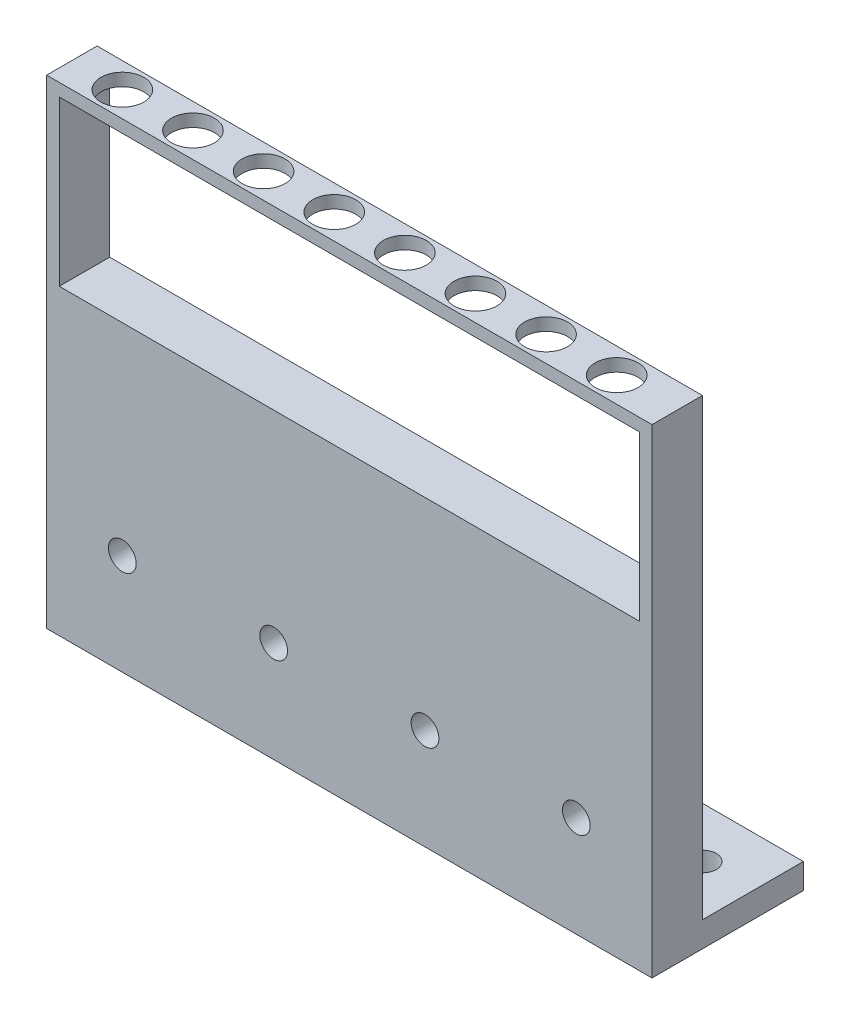
ISO-10303-21;
HEADER;
FILE_DESCRIPTION(('STEP AP214'),'2;1');
FILE_NAME('part.step','',(''),(''),'','','');
FILE_SCHEMA(('AUTOMOTIVE_DESIGN { 1 0 10303 214 1 1 1 1 }'));
ENDSEC;
DATA;
#1=APPLICATION_CONTEXT('core data for automotive mechanical design processes');
#2=APPLICATION_PROTOCOL_DEFINITION('international standard','automotive_design',2000,#1);
#3=PRODUCT_CONTEXT('',#1,'mechanical');
#4=PRODUCT('Part','Part','',(#3));
#5=PRODUCT_RELATED_PRODUCT_CATEGORY('part','',(#4));
#6=PRODUCT_DEFINITION_FORMATION('','',#4);
#7=PRODUCT_DEFINITION_CONTEXT('part definition',#1,'design');
#8=PRODUCT_DEFINITION('design','',#6,#7);
#9=PRODUCT_DEFINITION_SHAPE('','',#8);
#10=(LENGTH_UNIT() NAMED_UNIT(*) SI_UNIT(.MILLI.,.METRE.));
#11=(NAMED_UNIT(*) PLANE_ANGLE_UNIT() SI_UNIT($,.RADIAN.));
#12=(NAMED_UNIT(*) SI_UNIT($,.STERADIAN.) SOLID_ANGLE_UNIT());
#13=UNCERTAINTY_MEASURE_WITH_UNIT(LENGTH_MEASURE(1.E-05),#10,'distance_accuracy_value','');
#14=(GEOMETRIC_REPRESENTATION_CONTEXT(3) GLOBAL_UNCERTAINTY_ASSIGNED_CONTEXT((#13)) GLOBAL_UNIT_ASSIGNED_CONTEXT((#10,
#11,#12)) REPRESENTATION_CONTEXT('',''));
#15=CARTESIAN_POINT('',(0.,0.,0.));
#16=DIRECTION('',(0.,0.,1.));
#17=DIRECTION('',(1.,0.,0.));
#18=AXIS2_PLACEMENT_3D('',#15,#16,#17);
#19=CARTESIAN_POINT('',(-76.2,76.2,-6.35));
#20=DIRECTION('',(0.,0.,1.));
#21=DIRECTION('',(1.,0.,0.));
#22=AXIS2_PLACEMENT_3D('',#19,#20,#21);
#23=PLANE('',#22);
#24=CARTESIAN_POINT('',(19.05,25.4,-6.35));
#25=DIRECTION('',(0.,0.,-1.));
#26=DIRECTION('',(-1.,0.,0.));
#27=AXIS2_PLACEMENT_3D('',#24,#25,#26);
#28=CIRCLE('',#27,3.49250000000001);
#29=CARTESIAN_POINT('',(15.5575,25.4,-6.35));
#30=VERTEX_POINT('',#29);
#31=EDGE_CURVE('E321',#30,#30,#28,.T.);
#32=ORIENTED_EDGE('',*,*,#31,.F.);
#33=EDGE_LOOP('',(#32));
#34=FACE_BOUND('',#33,.T.);
#35=CARTESIAN_POINT('',(-19.05,25.4,-6.35));
#36=DIRECTION('',(0.,0.,-1.));
#37=DIRECTION('',(-1.,0.,0.));
#38=AXIS2_PLACEMENT_3D('',#35,#36,#37);
#39=CIRCLE('',#38,3.49250000000001);
#40=CARTESIAN_POINT('',(-22.5425,25.4,-6.35));
#41=VERTEX_POINT('',#40);
#42=EDGE_CURVE('E315',#41,#41,#39,.T.);
#43=ORIENTED_EDGE('',*,*,#42,.F.);
#44=EDGE_LOOP('',(#43));
#45=FACE_BOUND('',#44,.T.);
#46=CARTESIAN_POINT('',(-57.15,25.4,-6.35));
#47=DIRECTION('',(0.,0.,-1.));
#48=DIRECTION('',(-1.,0.,0.));
#49=AXIS2_PLACEMENT_3D('',#46,#47,#48);
#50=CIRCLE('',#49,3.49250000000001);
#51=CARTESIAN_POINT('',(-60.6425,25.4,-6.35));
#52=VERTEX_POINT('',#51);
#53=EDGE_CURVE('E309',#52,#52,#50,.T.);
#54=ORIENTED_EDGE('',*,*,#53,.F.);
#55=EDGE_LOOP('',(#54));
#56=FACE_BOUND('',#55,.T.);
#57=CARTESIAN_POINT('',(57.15,25.4,-6.35));
#58=DIRECTION('',(0.,0.,-1.));
#59=DIRECTION('',(-1.,0.,0.));
#60=AXIS2_PLACEMENT_3D('',#57,#58,#59);
#61=CIRCLE('',#60,3.49250000000001);
#62=CARTESIAN_POINT('',(53.6575,25.4,-6.35));
#63=VERTEX_POINT('',#62);
#64=EDGE_CURVE('E303',#63,#63,#61,.T.);
#65=ORIENTED_EDGE('',*,*,#64,.F.);
#66=EDGE_LOOP('',(#65));
#67=FACE_BOUND('',#66,.T.);
#68=DIRECTION('',(-1.,0.,0.));
#69=VECTOR('',#68,1.);
#70=CARTESIAN_POINT('',(-76.2,76.2,-6.35));
#71=LINE('',#70,#69);
#72=CARTESIAN_POINT('',(73.025,76.2,-6.34999999999999));
#73=VERTEX_POINT('',#72);
#74=CARTESIAN_POINT('',(-73.025,76.2,-6.35));
#75=VERTEX_POINT('',#74);
#76=EDGE_CURVE('E212',#73,#75,#71,.T.);
#77=ORIENTED_EDGE('',*,*,#76,.F.);
#78=DIRECTION('',(0.,1.,0.));
#79=VECTOR('',#78,1.);
#80=CARTESIAN_POINT('',(73.025,76.2,-6.34999999999999));
#81=LINE('',#80,#79);
#82=CARTESIAN_POINT('',(73.025,117.475,-6.34999999999999));
#83=VERTEX_POINT('',#82);
#84=EDGE_CURVE('E253',#73,#83,#81,.T.);
#85=ORIENTED_EDGE('',*,*,#84,.T.);
#86=DIRECTION('',(-1.,0.,0.));
#87=VECTOR('',#86,1.);
#88=CARTESIAN_POINT('',(73.025,117.475,-6.34999999999999));
#89=LINE('',#88,#87);
#90=CARTESIAN_POINT('',(-73.025,117.475,-6.34999999999999));
#91=VERTEX_POINT('',#90);
#92=EDGE_CURVE('E147',#83,#91,#89,.T.);
#93=ORIENTED_EDGE('',*,*,#92,.T.);
#94=DIRECTION('',(0.,-1.,0.));
#95=VECTOR('',#94,1.);
#96=CARTESIAN_POINT('',(-73.025,117.475,-6.34999999999999));
#97=LINE('',#96,#95);
#98=EDGE_CURVE('E115',#91,#75,#97,.T.);
#99=ORIENTED_EDGE('',*,*,#98,.T.);
#100=EDGE_LOOP('',(#77,#85,#93,#99));
#101=FACE_BOUND('',#100,.T.);
#102=DIRECTION('',(1.,0.,0.));
#103=VECTOR('',#102,1.);
#104=CARTESIAN_POINT('',(-76.2,6.35,-6.35));
#105=LINE('',#104,#103);
#106=CARTESIAN_POINT('',(-76.2,6.35000000000002,-6.35));
#107=VERTEX_POINT('',#106);
#108=CARTESIAN_POINT('',(76.2,6.35,-6.35));
#109=VERTEX_POINT('',#108);
#110=EDGE_CURVE('E196',#107,#109,#105,.T.);
#111=ORIENTED_EDGE('',*,*,#110,.F.);
#112=DIRECTION('',(0.,-1.,0.));
#113=VECTOR('',#112,1.);
#114=CARTESIAN_POINT('',(-76.2,76.2,-6.35));
#115=LINE('',#114,#113);
#116=CARTESIAN_POINT('',(-76.2,120.65,-6.34999999999999));
#117=VERTEX_POINT('',#116);
#118=EDGE_CURVE('E41',#117,#107,#115,.T.);
#119=ORIENTED_EDGE('',*,*,#118,.F.);
#120=DIRECTION('',(1.,0.,0.));
#121=VECTOR('',#120,1.);
#122=CARTESIAN_POINT('',(-76.2,120.65,-6.34999999999999));
#123=LINE('',#122,#121);
#124=CARTESIAN_POINT('',(76.2,120.65,-6.34999999999999));
#125=VERTEX_POINT('',#124);
#126=EDGE_CURVE('E137',#117,#125,#123,.T.);
#127=ORIENTED_EDGE('',*,*,#126,.T.);
#128=DIRECTION('',(0.,-1.,0.));
#129=VECTOR('',#128,1.);
#130=CARTESIAN_POINT('',(76.2,76.2,-6.35));
#131=LINE('',#130,#129);
#132=EDGE_CURVE('E11',#125,#109,#131,.T.);
#133=ORIENTED_EDGE('',*,*,#132,.T.);
#134=EDGE_LOOP('',(#111,#119,#127,#133));
#135=FACE_BOUND('',#134,.T.);
#136=ADVANCED_FACE('F33',(#34,#45,#56,#67,#101,#135),#23,.F.);
#137=CARTESIAN_POINT('',(76.2,76.2,6.35));
#138=DIRECTION('',(-1.,0.,0.));
#139=DIRECTION('',(0.,0.,1.));
#140=AXIS2_PLACEMENT_3D('',#137,#138,#139);
#141=PLANE('',#140);
#142=DIRECTION('',(0.,0.,-1.));
#143=VECTOR('',#142,1.);
#144=CARTESIAN_POINT('',(76.2,0.,6.35));
#145=LINE('',#144,#143);
#146=CARTESIAN_POINT('',(76.2,0.,6.35));
#147=VERTEX_POINT('',#146);
#148=CARTESIAN_POINT('',(76.2,0.,-31.75));
#149=VERTEX_POINT('',#148);
#150=EDGE_CURVE('E211',#147,#149,#145,.T.);
#151=ORIENTED_EDGE('',*,*,#150,.T.);
#152=DIRECTION('',(0.,-1.,0.));
#153=VECTOR('',#152,1.);
#154=CARTESIAN_POINT('',(76.2,6.35,-31.75));
#155=LINE('',#154,#153);
#156=CARTESIAN_POINT('',(76.2,6.35,-31.75));
#157=VERTEX_POINT('',#156);
#158=EDGE_CURVE('E208',#157,#149,#155,.T.);
#159=ORIENTED_EDGE('',*,*,#158,.F.);
#160=DIRECTION('',(0.,0.,-1.));
#161=VECTOR('',#160,1.);
#162=CARTESIAN_POINT('',(76.2,6.35,-6.35));
#163=LINE('',#162,#161);
#164=EDGE_CURVE('E199',#109,#157,#163,.T.);
#165=ORIENTED_EDGE('',*,*,#164,.F.);
#166=ORIENTED_EDGE('',*,*,#132,.F.);
#167=DIRECTION('',(0.,0.,1.));
#168=VECTOR('',#167,1.);
#169=CARTESIAN_POINT('',(76.2,120.65,-165.1));
#170=LINE('',#169,#168);
#171=CARTESIAN_POINT('',(76.2,120.65,6.35));
#172=VERTEX_POINT('',#171);
#173=EDGE_CURVE('E148',#125,#172,#170,.T.);
#174=ORIENTED_EDGE('',*,*,#173,.T.);
#175=DIRECTION('',(0.,-1.,0.));
#176=VECTOR('',#175,1.);
#177=CARTESIAN_POINT('',(76.2,76.2,6.35));
#178=LINE('',#177,#176);
#179=EDGE_CURVE('E216',#172,#147,#178,.T.);
#180=ORIENTED_EDGE('',*,*,#179,.T.);
#181=EDGE_LOOP('',(#151,#159,#165,#166,#174,#180));
#182=FACE_BOUND('',#181,.T.);
#183=ADVANCED_FACE('F35',(#182),#141,.F.);
#184=CARTESIAN_POINT('',(-76.2,76.2,6.35));
#185=DIRECTION('',(1.,0.,0.));
#186=DIRECTION('',(0.,0.,-1.));
#187=AXIS2_PLACEMENT_3D('',#184,#185,#186);
#188=PLANE('',#187);
#189=DIRECTION('',(0.,0.,1.));
#190=VECTOR('',#189,1.);
#191=CARTESIAN_POINT('',(-76.2,0.,6.35));
#192=LINE('',#191,#190);
#193=CARTESIAN_POINT('',(-76.2,0.,-31.75));
#194=VERTEX_POINT('',#193);
#195=CARTESIAN_POINT('',(-76.2,0.,6.35));
#196=VERTEX_POINT('',#195);
#197=EDGE_CURVE('E218',#194,#196,#192,.T.);
#198=ORIENTED_EDGE('',*,*,#197,.T.);
#199=DIRECTION('',(0.,-1.,0.));
#200=VECTOR('',#199,1.);
#201=CARTESIAN_POINT('',(-76.2,76.2,6.35));
#202=LINE('',#201,#200);
#203=CARTESIAN_POINT('',(-76.2,120.65,6.35));
#204=VERTEX_POINT('',#203);
#205=EDGE_CURVE('E223',#204,#196,#202,.T.);
#206=ORIENTED_EDGE('',*,*,#205,.F.);
#207=DIRECTION('',(0.,0.,1.));
#208=VECTOR('',#207,1.);
#209=CARTESIAN_POINT('',(-76.2,120.65,-165.1));
#210=LINE('',#209,#208);
#211=EDGE_CURVE('E144',#117,#204,#210,.T.);
#212=ORIENTED_EDGE('',*,*,#211,.F.);
#213=ORIENTED_EDGE('',*,*,#118,.T.);
#214=DIRECTION('',(0.,0.,1.));
#215=VECTOR('',#214,1.);
#216=CARTESIAN_POINT('',(-76.2,6.35,-19.05));
#217=LINE('',#216,#215);
#218=CARTESIAN_POINT('',(-76.2,6.35,-31.75));
#219=VERTEX_POINT('',#218);
#220=EDGE_CURVE('E193',#219,#107,#217,.T.);
#221=ORIENTED_EDGE('',*,*,#220,.F.);
#222=DIRECTION('',(0.,-1.,0.));
#223=VECTOR('',#222,1.);
#224=CARTESIAN_POINT('',(-76.2,6.35,-31.75));
#225=LINE('',#224,#223);
#226=EDGE_CURVE('E203',#219,#194,#225,.T.);
#227=ORIENTED_EDGE('',*,*,#226,.T.);
#228=EDGE_LOOP('',(#198,#206,#212,#213,#221,#227));
#229=FACE_BOUND('',#228,.T.);
#230=ADVANCED_FACE('F229',(#229),#188,.F.);
#231=CARTESIAN_POINT('',(-76.2,76.2,6.35));
#232=DIRECTION('',(0.,0.,-1.));
#233=DIRECTION('',(-1.,0.,0.));
#234=AXIS2_PLACEMENT_3D('',#231,#232,#233);
#235=PLANE('',#234);
#236=CARTESIAN_POINT('',(19.05,25.4,6.35));
#237=DIRECTION('',(0.,0.,-1.));
#238=DIRECTION('',(-1.,0.,0.));
#239=AXIS2_PLACEMENT_3D('',#236,#237,#238);
#240=CIRCLE('',#239,3.49250000000001);
#241=CARTESIAN_POINT('',(15.5575,25.4,6.35));
#242=VERTEX_POINT('',#241);
#243=EDGE_CURVE('E306',#242,#242,#240,.T.);
#244=ORIENTED_EDGE('',*,*,#243,.T.);
#245=EDGE_LOOP('',(#244));
#246=FACE_BOUND('',#245,.T.);
#247=CARTESIAN_POINT('',(-19.05,25.4,6.35));
#248=DIRECTION('',(0.,0.,-1.));
#249=DIRECTION('',(-1.,0.,0.));
#250=AXIS2_PLACEMENT_3D('',#247,#248,#249);
#251=CIRCLE('',#250,3.49250000000001);
#252=CARTESIAN_POINT('',(-22.5425,25.4,6.35));
#253=VERTEX_POINT('',#252);
#254=EDGE_CURVE('E318',#253,#253,#251,.T.);
#255=ORIENTED_EDGE('',*,*,#254,.T.);
#256=EDGE_LOOP('',(#255));
#257=FACE_BOUND('',#256,.T.);
#258=CARTESIAN_POINT('',(-57.15,25.4,6.35));
#259=DIRECTION('',(0.,0.,-1.));
#260=DIRECTION('',(-1.,0.,0.));
#261=AXIS2_PLACEMENT_3D('',#258,#259,#260);
#262=CIRCLE('',#261,3.49250000000001);
#263=CARTESIAN_POINT('',(-60.6425,25.4,6.35));
#264=VERTEX_POINT('',#263);
#265=EDGE_CURVE('E312',#264,#264,#262,.T.);
#266=ORIENTED_EDGE('',*,*,#265,.T.);
#267=EDGE_LOOP('',(#266));
#268=FACE_BOUND('',#267,.T.);
#269=CARTESIAN_POINT('',(57.15,25.4,6.35));
#270=DIRECTION('',(0.,0.,-1.));
#271=DIRECTION('',(-1.,0.,0.));
#272=AXIS2_PLACEMENT_3D('',#269,#270,#271);
#273=CIRCLE('',#272,3.49250000000001);
#274=CARTESIAN_POINT('',(53.6575,25.4,6.35));
#275=VERTEX_POINT('',#274);
#276=EDGE_CURVE('E265',#275,#275,#273,.T.);
#277=ORIENTED_EDGE('',*,*,#276,.T.);
#278=EDGE_LOOP('',(#277));
#279=FACE_BOUND('',#278,.T.);
#280=DIRECTION('',(1.,0.,0.));
#281=VECTOR('',#280,1.);
#282=CARTESIAN_POINT('',(-76.2,76.2,6.35));
#283=LINE('',#282,#281);
#284=CARTESIAN_POINT('',(-73.025,76.2,6.35));
#285=VERTEX_POINT('',#284);
#286=CARTESIAN_POINT('',(73.025,76.2,6.35));
#287=VERTEX_POINT('',#286);
#288=EDGE_CURVE('E48',#285,#287,#283,.T.);
#289=ORIENTED_EDGE('',*,*,#288,.F.);
#290=DIRECTION('',(0.,1.,0.));
#291=VECTOR('',#290,1.);
#292=CARTESIAN_POINT('',(-73.025,117.475,6.35));
#293=LINE('',#292,#291);
#294=CARTESIAN_POINT('',(-73.025,117.475,6.35));
#295=VERTEX_POINT('',#294);
#296=EDGE_CURVE('E113',#285,#295,#293,.T.);
#297=ORIENTED_EDGE('',*,*,#296,.T.);
#298=DIRECTION('',(1.,0.,0.));
#299=VECTOR('',#298,1.);
#300=CARTESIAN_POINT('',(73.025,117.475,6.35));
#301=LINE('',#300,#299);
#302=CARTESIAN_POINT('',(73.025,117.475,6.35));
#303=VERTEX_POINT('',#302);
#304=EDGE_CURVE('E121',#295,#303,#301,.T.);
#305=ORIENTED_EDGE('',*,*,#304,.T.);
#306=DIRECTION('',(0.,-1.,0.));
#307=VECTOR('',#306,1.);
#308=CARTESIAN_POINT('',(73.025,76.2,6.35));
#309=LINE('',#308,#307);
#310=EDGE_CURVE('E127',#303,#287,#309,.T.);
#311=ORIENTED_EDGE('',*,*,#310,.T.);
#312=EDGE_LOOP('',(#289,#297,#305,#311));
#313=FACE_BOUND('',#312,.T.);
#314=DIRECTION('',(1.,0.,0.));
#315=VECTOR('',#314,1.);
#316=CARTESIAN_POINT('',(-76.2,0.,6.35));
#317=LINE('',#316,#315);
#318=EDGE_CURVE('E214',#196,#147,#317,.T.);
#319=ORIENTED_EDGE('',*,*,#318,.T.);
#320=ORIENTED_EDGE('',*,*,#179,.F.);
#321=DIRECTION('',(-1.,0.,0.));
#322=VECTOR('',#321,1.);
#323=CARTESIAN_POINT('',(-76.2,120.65,6.35));
#324=LINE('',#323,#322);
#325=EDGE_CURVE('E141',#172,#204,#324,.T.);
#326=ORIENTED_EDGE('',*,*,#325,.T.);
#327=ORIENTED_EDGE('',*,*,#205,.T.);
#328=EDGE_LOOP('',(#319,#320,#326,#327));
#329=FACE_BOUND('',#328,.T.);
#330=ADVANCED_FACE('F129',(#246,#257,#268,#279,#313,#329),#235,.F.);
#331=CARTESIAN_POINT('',(0.,76.2,0.));
#332=DIRECTION('',(0.,-1.,0.));
#333=DIRECTION('',(0.,0.,-1.));
#334=AXIS2_PLACEMENT_3D('',#331,#332,#333);
#335=PLANE('',#334);
#336=ORIENTED_EDGE('',*,*,#288,.T.);
#337=DIRECTION('',(0.,0.,1.));
#338=VECTOR('',#337,1.);
#339=CARTESIAN_POINT('',(73.025,76.2,-165.1));
#340=LINE('',#339,#338);
#341=EDGE_CURVE('E151',#73,#287,#340,.T.);
#342=ORIENTED_EDGE('',*,*,#341,.F.);
#343=ORIENTED_EDGE('',*,*,#76,.T.);
#344=DIRECTION('',(0.,0.,1.));
#345=VECTOR('',#344,1.);
#346=CARTESIAN_POINT('',(-73.025,76.2,-165.1));
#347=LINE('',#346,#345);
#348=EDGE_CURVE('E53',#75,#285,#347,.T.);
#349=ORIENTED_EDGE('',*,*,#348,.T.);
#350=EDGE_LOOP('',(#336,#342,#343,#349));
#351=FACE_BOUND('',#350,.T.);
#352=ADVANCED_FACE('F343',(#351),#335,.F.);
#353=CARTESIAN_POINT('',(0.,0.,0.));
#354=DIRECTION('',(0.,-1.,0.));
#355=DIRECTION('',(0.,0.,-1.));
#356=AXIS2_PLACEMENT_3D('',#353,#354,#355);
#357=PLANE('',#356);
#358=ORIENTED_EDGE('',*,*,#150,.F.);
#359=ORIENTED_EDGE('',*,*,#318,.F.);
#360=ORIENTED_EDGE('',*,*,#197,.F.);
#361=DIRECTION('',(-1.,0.,0.));
#362=VECTOR('',#361,1.);
#363=CARTESIAN_POINT('',(76.2,0.,-31.75));
#364=LINE('',#363,#362);
#365=EDGE_CURVE('E190',#149,#194,#364,.T.);
#366=ORIENTED_EDGE('',*,*,#365,.F.);
#367=EDGE_LOOP('',(#358,#359,#360,#366));
#368=FACE_BOUND('',#367,.T.);
#369=CARTESIAN_POINT('',(-63.5,0.,-19.05));
#370=DIRECTION('',(0.,1.,0.));
#371=DIRECTION('',(0.,0.,1.));
#372=AXIS2_PLACEMENT_3D('',#369,#370,#371);
#373=CIRCLE('',#372,3.4925);
#374=CARTESIAN_POINT('',(-63.5,0.,-15.5575));
#375=VERTEX_POINT('',#374);
#376=EDGE_CURVE('E184',#375,#375,#373,.T.);
#377=ORIENTED_EDGE('',*,*,#376,.T.);
#378=EDGE_LOOP('',(#377));
#379=FACE_BOUND('',#378,.T.);
#380=CARTESIAN_POINT('',(-38.1,0.,-19.05));
#381=DIRECTION('',(0.,1.,0.));
#382=DIRECTION('',(0.,0.,1.));
#383=AXIS2_PLACEMENT_3D('',#380,#381,#382);
#384=CIRCLE('',#383,3.49250000000001);
#385=CARTESIAN_POINT('',(-38.1,0.,-15.5575));
#386=VERTEX_POINT('',#385);
#387=EDGE_CURVE('E178',#386,#386,#384,.T.);
#388=ORIENTED_EDGE('',*,*,#387,.T.);
#389=EDGE_LOOP('',(#388));
#390=FACE_BOUND('',#389,.T.);
#391=CARTESIAN_POINT('',(-12.7,0.,-19.05));
#392=DIRECTION('',(0.,1.,0.));
#393=DIRECTION('',(0.,0.,1.));
#394=AXIS2_PLACEMENT_3D('',#391,#392,#393);
#395=CIRCLE('',#394,3.4925);
#396=CARTESIAN_POINT('',(-12.7,0.,-15.5575));
#397=VERTEX_POINT('',#396);
#398=EDGE_CURVE('E172',#397,#397,#395,.T.);
#399=ORIENTED_EDGE('',*,*,#398,.T.);
#400=EDGE_LOOP('',(#399));
#401=FACE_BOUND('',#400,.T.);
#402=CARTESIAN_POINT('',(12.6999999999999,0.,-19.05));
#403=DIRECTION('',(0.,1.,0.));
#404=DIRECTION('',(0.,0.,1.));
#405=AXIS2_PLACEMENT_3D('',#402,#403,#404);
#406=CIRCLE('',#405,3.4925);
#407=CARTESIAN_POINT('',(12.6999999999999,0.,-15.5575));
#408=VERTEX_POINT('',#407);
#409=EDGE_CURVE('E166',#408,#408,#406,.T.);
#410=ORIENTED_EDGE('',*,*,#409,.T.);
#411=EDGE_LOOP('',(#410));
#412=FACE_BOUND('',#411,.T.);
#413=CARTESIAN_POINT('',(38.0999999999999,0.,-19.05));
#414=DIRECTION('',(0.,1.,0.));
#415=DIRECTION('',(0.,0.,1.));
#416=AXIS2_PLACEMENT_3D('',#413,#414,#415);
#417=CIRCLE('',#416,3.49250000000001);
#418=CARTESIAN_POINT('',(38.0999999999999,0.,-15.5575));
#419=VERTEX_POINT('',#418);
#420=EDGE_CURVE('E160',#419,#419,#417,.T.);
#421=ORIENTED_EDGE('',*,*,#420,.T.);
#422=EDGE_LOOP('',(#421));
#423=FACE_BOUND('',#422,.T.);
#424=CARTESIAN_POINT('',(63.4999999999999,0.,-19.05));
#425=DIRECTION('',(0.,1.,0.));
#426=DIRECTION('',(0.,0.,1.));
#427=AXIS2_PLACEMENT_3D('',#424,#425,#426);
#428=CIRCLE('',#427,3.49250000000001);
#429=CARTESIAN_POINT('',(63.4999999999999,0.,-15.5575));
#430=VERTEX_POINT('',#429);
#431=EDGE_CURVE('E156',#430,#430,#428,.T.);
#432=ORIENTED_EDGE('',*,*,#431,.T.);
#433=EDGE_LOOP('',(#432));
#434=FACE_BOUND('',#433,.T.);
#435=ADVANCED_FACE('F247',(#368,#379,#390,#401,#412,#423,#434),#357,.T.);
#436=CARTESIAN_POINT('',(0.,6.35,0.));
#437=DIRECTION('',(0.,1.,0.));
#438=DIRECTION('',(0.,0.,1.));
#439=AXIS2_PLACEMENT_3D('',#436,#437,#438);
#440=PLANE('',#439);
#441=CARTESIAN_POINT('',(38.0999999999999,6.35,-19.05));
#442=DIRECTION('',(0.,1.,0.));
#443=DIRECTION('',(0.,0.,1.));
#444=AXIS2_PLACEMENT_3D('',#441,#442,#443);
#445=CIRCLE('',#444,3.49250000000001);
#446=CARTESIAN_POINT('',(38.0999999999999,6.35,-15.5575));
#447=VERTEX_POINT('',#446);
#448=EDGE_CURVE('E163',#447,#447,#445,.T.);
#449=ORIENTED_EDGE('',*,*,#448,.F.);
#450=EDGE_LOOP('',(#449));
#451=FACE_BOUND('',#450,.T.);
#452=CARTESIAN_POINT('',(-12.7,6.35,-19.05));
#453=DIRECTION('',(0.,1.,0.));
#454=DIRECTION('',(0.,0.,1.));
#455=AXIS2_PLACEMENT_3D('',#452,#453,#454);
#456=CIRCLE('',#455,3.4925);
#457=CARTESIAN_POINT('',(-12.7,6.35,-15.5575));
#458=VERTEX_POINT('',#457);
#459=EDGE_CURVE('E175',#458,#458,#456,.T.);
#460=ORIENTED_EDGE('',*,*,#459,.F.);
#461=EDGE_LOOP('',(#460));
#462=FACE_BOUND('',#461,.T.);
#463=CARTESIAN_POINT('',(-63.5,6.35,-19.05));
#464=DIRECTION('',(0.,1.,0.));
#465=DIRECTION('',(0.,0.,1.));
#466=AXIS2_PLACEMENT_3D('',#463,#464,#465);
#467=CIRCLE('',#466,3.4925);
#468=CARTESIAN_POINT('',(-63.5,6.35,-15.5575));
#469=VERTEX_POINT('',#468);
#470=EDGE_CURVE('E187',#469,#469,#467,.T.);
#471=ORIENTED_EDGE('',*,*,#470,.F.);
#472=EDGE_LOOP('',(#471));
#473=FACE_BOUND('',#472,.T.);
#474=ORIENTED_EDGE('',*,*,#220,.T.);
#475=ORIENTED_EDGE('',*,*,#110,.T.);
#476=ORIENTED_EDGE('',*,*,#164,.T.);
#477=DIRECTION('',(-1.,0.,0.));
#478=VECTOR('',#477,1.);
#479=CARTESIAN_POINT('',(76.2,6.35,-31.75));
#480=LINE('',#479,#478);
#481=EDGE_CURVE('E201',#157,#219,#480,.T.);
#482=ORIENTED_EDGE('',*,*,#481,.T.);
#483=EDGE_LOOP('',(#474,#475,#476,#482));
#484=FACE_BOUND('',#483,.T.);
#485=CARTESIAN_POINT('',(-38.1,6.35,-19.05));
#486=DIRECTION('',(0.,1.,0.));
#487=DIRECTION('',(0.,0.,1.));
#488=AXIS2_PLACEMENT_3D('',#485,#486,#487);
#489=CIRCLE('',#488,3.49250000000001);
#490=CARTESIAN_POINT('',(-38.1,6.35,-15.5575));
#491=VERTEX_POINT('',#490);
#492=EDGE_CURVE('E181',#491,#491,#489,.T.);
#493=ORIENTED_EDGE('',*,*,#492,.F.);
#494=EDGE_LOOP('',(#493));
#495=FACE_BOUND('',#494,.T.);
#496=CARTESIAN_POINT('',(12.6999999999999,6.35,-19.05));
#497=DIRECTION('',(0.,1.,0.));
#498=DIRECTION('',(0.,0.,1.));
#499=AXIS2_PLACEMENT_3D('',#496,#497,#498);
#500=CIRCLE('',#499,3.4925);
#501=CARTESIAN_POINT('',(12.6999999999999,6.35,-15.5575));
#502=VERTEX_POINT('',#501);
#503=EDGE_CURVE('E169',#502,#502,#500,.T.);
#504=ORIENTED_EDGE('',*,*,#503,.F.);
#505=EDGE_LOOP('',(#504));
#506=FACE_BOUND('',#505,.T.);
#507=CARTESIAN_POINT('',(63.4999999999999,6.35,-19.05));
#508=DIRECTION('',(0.,1.,0.));
#509=DIRECTION('',(0.,0.,1.));
#510=AXIS2_PLACEMENT_3D('',#507,#508,#509);
#511=CIRCLE('',#510,3.49250000000001);
#512=CARTESIAN_POINT('',(63.4999999999999,6.35,-15.5575));
#513=VERTEX_POINT('',#512);
#514=EDGE_CURVE('E157',#513,#513,#511,.T.);
#515=ORIENTED_EDGE('',*,*,#514,.F.);
#516=EDGE_LOOP('',(#515));
#517=FACE_BOUND('',#516,.T.);
#518=ADVANCED_FACE('F234',(#451,#462,#473,#484,#495,#506,#517),#440,.T.);
#519=CARTESIAN_POINT('',(76.2,6.35,-31.75));
#520=DIRECTION('',(0.,0.,1.));
#521=DIRECTION('',(1.,0.,0.));
#522=AXIS2_PLACEMENT_3D('',#519,#520,#521);
#523=PLANE('',#522);
#524=ORIENTED_EDGE('',*,*,#365,.T.);
#525=ORIENTED_EDGE('',*,*,#226,.F.);
#526=ORIENTED_EDGE('',*,*,#481,.F.);
#527=ORIENTED_EDGE('',*,*,#158,.T.);
#528=EDGE_LOOP('',(#524,#525,#526,#527));
#529=FACE_BOUND('',#528,.T.);
#530=ADVANCED_FACE('F241',(#529),#523,.F.);
#531=CARTESIAN_POINT('',(-63.5,6.35,-19.05));
#532=DIRECTION('',(0.,-1.,0.));
#533=DIRECTION('',(0.,0.,-1.));
#534=AXIS2_PLACEMENT_3D('',#531,#532,#533);
#535=CYLINDRICAL_SURFACE('',#534,3.4925);
#536=ORIENTED_EDGE('',*,*,#470,.T.);
#537=EDGE_LOOP('',(#536));
#538=FACE_BOUND('',#537,.T.);
#539=ORIENTED_EDGE('',*,*,#376,.F.);
#540=EDGE_LOOP('',(#539));
#541=FACE_BOUND('',#540,.T.);
#542=ADVANCED_FACE('F380',(#538,#541),#535,.F.);
#543=CARTESIAN_POINT('',(-38.1,6.35,-19.05));
#544=DIRECTION('',(0.,-1.,0.));
#545=DIRECTION('',(0.,0.,-1.));
#546=AXIS2_PLACEMENT_3D('',#543,#544,#545);
#547=CYLINDRICAL_SURFACE('',#546,3.49250000000001);
#548=ORIENTED_EDGE('',*,*,#492,.T.);
#549=EDGE_LOOP('',(#548));
#550=FACE_BOUND('',#549,.T.);
#551=ORIENTED_EDGE('',*,*,#387,.F.);
#552=EDGE_LOOP('',(#551));
#553=FACE_BOUND('',#552,.T.);
#554=ADVANCED_FACE('F376',(#550,#553),#547,.F.);
#555=CARTESIAN_POINT('',(-12.7,6.35,-19.05));
#556=DIRECTION('',(0.,-1.,0.));
#557=DIRECTION('',(0.,0.,-1.));
#558=AXIS2_PLACEMENT_3D('',#555,#556,#557);
#559=CYLINDRICAL_SURFACE('',#558,3.4925);
#560=ORIENTED_EDGE('',*,*,#459,.T.);
#561=EDGE_LOOP('',(#560));
#562=FACE_BOUND('',#561,.T.);
#563=ORIENTED_EDGE('',*,*,#398,.F.);
#564=EDGE_LOOP('',(#563));
#565=FACE_BOUND('',#564,.T.);
#566=ADVANCED_FACE('F372',(#562,#565),#559,.F.);
#567=CARTESIAN_POINT('',(12.6999999999999,6.35,-19.05));
#568=DIRECTION('',(0.,-1.,0.));
#569=DIRECTION('',(0.,0.,-1.));
#570=AXIS2_PLACEMENT_3D('',#567,#568,#569);
#571=CYLINDRICAL_SURFACE('',#570,3.4925);
#572=ORIENTED_EDGE('',*,*,#503,.T.);
#573=EDGE_LOOP('',(#572));
#574=FACE_BOUND('',#573,.T.);
#575=ORIENTED_EDGE('',*,*,#409,.F.);
#576=EDGE_LOOP('',(#575));
#577=FACE_BOUND('',#576,.T.);
#578=ADVANCED_FACE('F368',(#574,#577),#571,.F.);
#579=CARTESIAN_POINT('',(38.0999999999999,6.35,-19.05));
#580=DIRECTION('',(0.,-1.,0.));
#581=DIRECTION('',(0.,0.,-1.));
#582=AXIS2_PLACEMENT_3D('',#579,#580,#581);
#583=CYLINDRICAL_SURFACE('',#582,3.49250000000001);
#584=ORIENTED_EDGE('',*,*,#448,.T.);
#585=EDGE_LOOP('',(#584));
#586=FACE_BOUND('',#585,.T.);
#587=ORIENTED_EDGE('',*,*,#420,.F.);
#588=EDGE_LOOP('',(#587));
#589=FACE_BOUND('',#588,.T.);
#590=ADVANCED_FACE('F364',(#586,#589),#583,.F.);
#591=CARTESIAN_POINT('',(63.4999999999999,6.35,-19.05));
#592=DIRECTION('',(0.,-1.,0.));
#593=DIRECTION('',(0.,0.,-1.));
#594=AXIS2_PLACEMENT_3D('',#591,#592,#593);
#595=CYLINDRICAL_SURFACE('',#594,3.49250000000001);
#596=ORIENTED_EDGE('',*,*,#514,.T.);
#597=EDGE_LOOP('',(#596));
#598=FACE_BOUND('',#597,.T.);
#599=ORIENTED_EDGE('',*,*,#431,.F.);
#600=EDGE_LOOP('',(#599));
#601=FACE_BOUND('',#600,.T.);
#602=ADVANCED_FACE('F354',(#598,#601),#595,.F.);
#603=CARTESIAN_POINT('',(-76.2,120.65,-165.1));
#604=DIRECTION('',(0.,1.,0.));
#605=DIRECTION('',(0.,0.,1.));
#606=AXIS2_PLACEMENT_3D('',#603,#604,#605);
#607=PLANE('',#606);
#608=CARTESIAN_POINT('',(-45.72,120.65,0.));
#609=DIRECTION('',(0.,1.,0.));
#610=DIRECTION('',(0.,0.,1.));
#611=AXIS2_PLACEMENT_3D('',#608,#609,#610);
#612=CIRCLE('',#611,5.3975);
#613=CARTESIAN_POINT('',(-45.72,120.65,5.3975));
#614=VERTEX_POINT('',#613);
#615=EDGE_CURVE('E259',#614,#614,#612,.T.);
#616=ORIENTED_EDGE('',*,*,#615,.F.);
#617=EDGE_LOOP('',(#616));
#618=FACE_BOUND('',#617,.T.);
#619=CARTESIAN_POINT('',(-27.94,120.65,0.));
#620=DIRECTION('',(0.,1.,0.));
#621=DIRECTION('',(0.,0.,1.));
#622=AXIS2_PLACEMENT_3D('',#619,#620,#621);
#623=CIRCLE('',#622,5.3975);
#624=CARTESIAN_POINT('',(-27.94,120.65,5.3975));
#625=VERTEX_POINT('',#624);
#626=EDGE_CURVE('E295',#625,#625,#623,.T.);
#627=ORIENTED_EDGE('',*,*,#626,.F.);
#628=EDGE_LOOP('',(#627));
#629=FACE_BOUND('',#628,.T.);
#630=CARTESIAN_POINT('',(-10.16,120.65,0.));
#631=DIRECTION('',(0.,1.,0.));
#632=DIRECTION('',(0.,0.,1.));
#633=AXIS2_PLACEMENT_3D('',#630,#631,#632);
#634=CIRCLE('',#633,5.3975);
#635=CARTESIAN_POINT('',(-10.16,120.65,5.3975));
#636=VERTEX_POINT('',#635);
#637=EDGE_CURVE('E289',#636,#636,#634,.T.);
#638=ORIENTED_EDGE('',*,*,#637,.F.);
#639=EDGE_LOOP('',(#638));
#640=FACE_BOUND('',#639,.T.);
#641=CARTESIAN_POINT('',(7.61999999999997,120.65,0.));
#642=DIRECTION('',(0.,1.,0.));
#643=DIRECTION('',(0.,0.,1.));
#644=AXIS2_PLACEMENT_3D('',#641,#642,#643);
#645=CIRCLE('',#644,5.3975);
#646=CARTESIAN_POINT('',(7.61999999999997,120.65,5.3975));
#647=VERTEX_POINT('',#646);
#648=EDGE_CURVE('E283',#647,#647,#645,.T.);
#649=ORIENTED_EDGE('',*,*,#648,.F.);
#650=EDGE_LOOP('',(#649));
#651=FACE_BOUND('',#650,.T.);
#652=CARTESIAN_POINT('',(25.4,120.65,0.));
#653=DIRECTION('',(0.,1.,0.));
#654=DIRECTION('',(0.,0.,1.));
#655=AXIS2_PLACEMENT_3D('',#652,#653,#654);
#656=CIRCLE('',#655,5.3975);
#657=CARTESIAN_POINT('',(25.4,120.65,5.3975));
#658=VERTEX_POINT('',#657);
#659=EDGE_CURVE('E277',#658,#658,#656,.T.);
#660=ORIENTED_EDGE('',*,*,#659,.F.);
#661=EDGE_LOOP('',(#660));
#662=FACE_BOUND('',#661,.T.);
#663=CARTESIAN_POINT('',(43.18,120.65,0.));
#664=DIRECTION('',(0.,1.,0.));
#665=DIRECTION('',(0.,0.,1.));
#666=AXIS2_PLACEMENT_3D('',#663,#664,#665);
#667=CIRCLE('',#666,5.3975);
#668=CARTESIAN_POINT('',(43.18,120.65,5.3975));
#669=VERTEX_POINT('',#668);
#670=EDGE_CURVE('E271',#669,#669,#667,.T.);
#671=ORIENTED_EDGE('',*,*,#670,.F.);
#672=EDGE_LOOP('',(#671));
#673=FACE_BOUND('',#672,.T.);
#674=CARTESIAN_POINT('',(60.96,120.65,0.));
#675=DIRECTION('',(0.,1.,0.));
#676=DIRECTION('',(0.,0.,1.));
#677=AXIS2_PLACEMENT_3D('',#674,#675,#676);
#678=CIRCLE('',#677,5.3975);
#679=CARTESIAN_POINT('',(60.96,120.65,5.3975));
#680=VERTEX_POINT('',#679);
#681=EDGE_CURVE('E264',#680,#680,#678,.T.);
#682=ORIENTED_EDGE('',*,*,#681,.F.);
#683=EDGE_LOOP('',(#682));
#684=FACE_BOUND('',#683,.T.);
#685=CARTESIAN_POINT('',(-63.5,120.65,0.));
#686=DIRECTION('',(0.,1.,0.));
#687=DIRECTION('',(0.,0.,1.));
#688=AXIS2_PLACEMENT_3D('',#685,#686,#687);
#689=CIRCLE('',#688,5.3975);
#690=CARTESIAN_POINT('',(-63.5,120.65,5.3975));
#691=VERTEX_POINT('',#690);
#692=EDGE_CURVE('E131',#691,#691,#689,.T.);
#693=ORIENTED_EDGE('',*,*,#692,.F.);
#694=EDGE_LOOP('',(#693));
#695=FACE_BOUND('',#694,.T.);
#696=ORIENTED_EDGE('',*,*,#126,.F.);
#697=ORIENTED_EDGE('',*,*,#211,.T.);
#698=ORIENTED_EDGE('',*,*,#325,.F.);
#699=ORIENTED_EDGE('',*,*,#173,.F.);
#700=EDGE_LOOP('',(#696,#697,#698,#699));
#701=FACE_BOUND('',#700,.T.);
#702=ADVANCED_FACE('F252',(#618,#629,#640,#651,#662,#673,#684,#695,#701),#607,.T.);
#703=CARTESIAN_POINT('',(73.025,76.2,-165.1));
#704=DIRECTION('',(-1.,0.,0.));
#705=DIRECTION('',(0.,0.,1.));
#706=AXIS2_PLACEMENT_3D('',#703,#704,#705);
#707=PLANE('',#706);
#708=ORIENTED_EDGE('',*,*,#84,.F.);
#709=ORIENTED_EDGE('',*,*,#341,.T.);
#710=ORIENTED_EDGE('',*,*,#310,.F.);
#711=DIRECTION('',(0.,0.,1.));
#712=VECTOR('',#711,1.);
#713=CARTESIAN_POINT('',(73.025,117.475,-165.1));
#714=LINE('',#713,#712);
#715=EDGE_CURVE('E118',#83,#303,#714,.T.);
#716=ORIENTED_EDGE('',*,*,#715,.F.);
#717=EDGE_LOOP('',(#708,#709,#710,#716));
#718=FACE_BOUND('',#717,.T.);
#719=ADVANCED_FACE('F345',(#718),#707,.T.);
#720=CARTESIAN_POINT('',(73.025,117.475,-165.1));
#721=DIRECTION('',(0.,-1.,0.));
#722=DIRECTION('',(1.,0.,0.));
#723=AXIS2_PLACEMENT_3D('',#720,#721,#722);
#724=PLANE('',#723);
#725=CARTESIAN_POINT('',(-45.72,117.475,0.));
#726=DIRECTION('',(0.,-1.,0.));
#727=DIRECTION('',(1.,0.,0.));
#728=AXIS2_PLACEMENT_3D('',#725,#726,#727);
#729=CIRCLE('',#728,5.3975);
#730=CARTESIAN_POINT('',(-40.3225,117.475,0.));
#731=VERTEX_POINT('',#730);
#732=EDGE_CURVE('E298',#731,#731,#729,.F.);
#733=ORIENTED_EDGE('',*,*,#732,.T.);
#734=EDGE_LOOP('',(#733));
#735=FACE_BOUND('',#734,.T.);
#736=CARTESIAN_POINT('',(-27.94,117.475,0.));
#737=DIRECTION('',(0.,-1.,0.));
#738=DIRECTION('',(1.,0.,0.));
#739=AXIS2_PLACEMENT_3D('',#736,#737,#738);
#740=CIRCLE('',#739,5.3975);
#741=CARTESIAN_POINT('',(-22.5425,117.475,0.));
#742=VERTEX_POINT('',#741);
#743=EDGE_CURVE('E292',#742,#742,#740,.F.);
#744=ORIENTED_EDGE('',*,*,#743,.T.);
#745=EDGE_LOOP('',(#744));
#746=FACE_BOUND('',#745,.T.);
#747=CARTESIAN_POINT('',(-10.16,117.475,0.));
#748=DIRECTION('',(0.,-1.,0.));
#749=DIRECTION('',(1.,0.,0.));
#750=AXIS2_PLACEMENT_3D('',#747,#748,#749);
#751=CIRCLE('',#750,5.3975);
#752=CARTESIAN_POINT('',(-4.76250000000002,117.475,0.));
#753=VERTEX_POINT('',#752);
#754=EDGE_CURVE('E286',#753,#753,#751,.F.);
#755=ORIENTED_EDGE('',*,*,#754,.T.);
#756=EDGE_LOOP('',(#755));
#757=FACE_BOUND('',#756,.T.);
#758=CARTESIAN_POINT('',(7.61999999999997,117.475,0.));
#759=DIRECTION('',(0.,-1.,0.));
#760=DIRECTION('',(1.,0.,0.));
#761=AXIS2_PLACEMENT_3D('',#758,#759,#760);
#762=CIRCLE('',#761,5.3975);
#763=CARTESIAN_POINT('',(13.0175,117.475,0.));
#764=VERTEX_POINT('',#763);
#765=EDGE_CURVE('E280',#764,#764,#762,.F.);
#766=ORIENTED_EDGE('',*,*,#765,.T.);
#767=EDGE_LOOP('',(#766));
#768=FACE_BOUND('',#767,.T.);
#769=CARTESIAN_POINT('',(25.4,117.475,0.));
#770=DIRECTION('',(0.,-1.,0.));
#771=DIRECTION('',(1.,0.,0.));
#772=AXIS2_PLACEMENT_3D('',#769,#770,#771);
#773=CIRCLE('',#772,5.3975);
#774=CARTESIAN_POINT('',(30.7975,117.475,0.));
#775=VERTEX_POINT('',#774);
#776=EDGE_CURVE('E274',#775,#775,#773,.F.);
#777=ORIENTED_EDGE('',*,*,#776,.T.);
#778=EDGE_LOOP('',(#777));
#779=FACE_BOUND('',#778,.T.);
#780=CARTESIAN_POINT('',(43.18,117.475,0.));
#781=DIRECTION('',(0.,-1.,0.));
#782=DIRECTION('',(1.,0.,0.));
#783=AXIS2_PLACEMENT_3D('',#780,#781,#782);
#784=CIRCLE('',#783,5.3975);
#785=CARTESIAN_POINT('',(48.5775,117.475,0.));
#786=VERTEX_POINT('',#785);
#787=EDGE_CURVE('E268',#786,#786,#784,.F.);
#788=ORIENTED_EDGE('',*,*,#787,.T.);
#789=EDGE_LOOP('',(#788));
#790=FACE_BOUND('',#789,.T.);
#791=CARTESIAN_POINT('',(60.96,117.475,0.));
#792=DIRECTION('',(0.,-1.,0.));
#793=DIRECTION('',(1.,0.,0.));
#794=AXIS2_PLACEMENT_3D('',#791,#792,#793);
#795=CIRCLE('',#794,5.3975);
#796=CARTESIAN_POINT('',(66.3575,117.475,0.));
#797=VERTEX_POINT('',#796);
#798=EDGE_CURVE('E261',#797,#797,#795,.F.);
#799=ORIENTED_EDGE('',*,*,#798,.T.);
#800=EDGE_LOOP('',(#799));
#801=FACE_BOUND('',#800,.T.);
#802=CARTESIAN_POINT('',(-63.5,117.475,0.));
#803=DIRECTION('',(0.,-1.,0.));
#804=DIRECTION('',(1.,0.,0.));
#805=AXIS2_PLACEMENT_3D('',#802,#803,#804);
#806=CIRCLE('',#805,5.3975);
#807=CARTESIAN_POINT('',(-58.1025,117.475,0.));
#808=VERTEX_POINT('',#807);
#809=EDGE_CURVE('E134',#808,#808,#806,.F.);
#810=ORIENTED_EDGE('',*,*,#809,.T.);
#811=EDGE_LOOP('',(#810));
#812=FACE_BOUND('',#811,.T.);
#813=ORIENTED_EDGE('',*,*,#92,.F.);
#814=ORIENTED_EDGE('',*,*,#715,.T.);
#815=ORIENTED_EDGE('',*,*,#304,.F.);
#816=DIRECTION('',(0.,0.,1.));
#817=VECTOR('',#816,1.);
#818=CARTESIAN_POINT('',(-73.025,117.475,-165.1));
#819=LINE('',#818,#817);
#820=EDGE_CURVE('E109',#91,#295,#819,.T.);
#821=ORIENTED_EDGE('',*,*,#820,.F.);
#822=EDGE_LOOP('',(#813,#814,#815,#821));
#823=FACE_BOUND('',#822,.T.);
#824=ADVANCED_FACE('F122',(#735,#746,#757,#768,#779,#790,#801,#812,#823),#724,.T.);
#825=CARTESIAN_POINT('',(-73.025,117.475,-165.1));
#826=DIRECTION('',(1.,0.,0.));
#827=DIRECTION('',(0.,0.,-1.));
#828=AXIS2_PLACEMENT_3D('',#825,#826,#827);
#829=PLANE('',#828);
#830=ORIENTED_EDGE('',*,*,#98,.F.);
#831=ORIENTED_EDGE('',*,*,#820,.T.);
#832=ORIENTED_EDGE('',*,*,#296,.F.);
#833=ORIENTED_EDGE('',*,*,#348,.F.);
#834=EDGE_LOOP('',(#830,#831,#832,#833));
#835=FACE_BOUND('',#834,.T.);
#836=ADVANCED_FACE('F111',(#835),#829,.T.);
#837=CARTESIAN_POINT('',(-63.5,-0.001000000000001,0.));
#838=DIRECTION('',(0.,1.,0.));
#839=DIRECTION('',(0.,0.,1.));
#840=AXIS2_PLACEMENT_3D('',#837,#838,#839);
#841=CYLINDRICAL_SURFACE('',#840,5.3975);
#842=ORIENTED_EDGE('',*,*,#809,.F.);
#843=EDGE_LOOP('',(#842));
#844=FACE_BOUND('',#843,.T.);
#845=ORIENTED_EDGE('',*,*,#692,.T.);
#846=EDGE_LOOP('',(#845));
#847=FACE_BOUND('',#846,.T.);
#848=ADVANCED_FACE('F361',(#844,#847),#841,.F.);
#849=CARTESIAN_POINT('',(60.96,-0.001000000000001,0.));
#850=DIRECTION('',(0.,1.,0.));
#851=DIRECTION('',(0.,0.,1.));
#852=AXIS2_PLACEMENT_3D('',#849,#850,#851);
#853=CYLINDRICAL_SURFACE('',#852,5.3975);
#854=ORIENTED_EDGE('',*,*,#798,.F.);
#855=EDGE_LOOP('',(#854));
#856=FACE_BOUND('',#855,.T.);
#857=ORIENTED_EDGE('',*,*,#681,.T.);
#858=EDGE_LOOP('',(#857));
#859=FACE_BOUND('',#858,.T.);
#860=ADVANCED_FACE('F487',(#856,#859),#853,.F.);
#861=CARTESIAN_POINT('',(43.18,-0.001000000000001,0.));
#862=DIRECTION('',(0.,1.,0.));
#863=DIRECTION('',(0.,0.,1.));
#864=AXIS2_PLACEMENT_3D('',#861,#862,#863);
#865=CYLINDRICAL_SURFACE('',#864,5.3975);
#866=ORIENTED_EDGE('',*,*,#787,.F.);
#867=EDGE_LOOP('',(#866));
#868=FACE_BOUND('',#867,.T.);
#869=ORIENTED_EDGE('',*,*,#670,.T.);
#870=EDGE_LOOP('',(#869));
#871=FACE_BOUND('',#870,.T.);
#872=ADVANCED_FACE('F483',(#868,#871),#865,.F.);
#873=CARTESIAN_POINT('',(25.4,-0.001000000000001,0.));
#874=DIRECTION('',(0.,1.,0.));
#875=DIRECTION('',(0.,0.,1.));
#876=AXIS2_PLACEMENT_3D('',#873,#874,#875);
#877=CYLINDRICAL_SURFACE('',#876,5.3975);
#878=ORIENTED_EDGE('',*,*,#776,.F.);
#879=EDGE_LOOP('',(#878));
#880=FACE_BOUND('',#879,.T.);
#881=ORIENTED_EDGE('',*,*,#659,.T.);
#882=EDGE_LOOP('',(#881));
#883=FACE_BOUND('',#882,.T.);
#884=ADVANCED_FACE('F479',(#880,#883),#877,.F.);
#885=CARTESIAN_POINT('',(7.61999999999997,-0.001000000000001,0.));
#886=DIRECTION('',(0.,1.,0.));
#887=DIRECTION('',(0.,0.,1.));
#888=AXIS2_PLACEMENT_3D('',#885,#886,#887);
#889=CYLINDRICAL_SURFACE('',#888,5.3975);
#890=ORIENTED_EDGE('',*,*,#765,.F.);
#891=EDGE_LOOP('',(#890));
#892=FACE_BOUND('',#891,.T.);
#893=ORIENTED_EDGE('',*,*,#648,.T.);
#894=EDGE_LOOP('',(#893));
#895=FACE_BOUND('',#894,.T.);
#896=ADVANCED_FACE('F475',(#892,#895),#889,.F.);
#897=CARTESIAN_POINT('',(-10.16,-0.001000000000001,0.));
#898=DIRECTION('',(0.,1.,0.));
#899=DIRECTION('',(0.,0.,1.));
#900=AXIS2_PLACEMENT_3D('',#897,#898,#899);
#901=CYLINDRICAL_SURFACE('',#900,5.3975);
#902=ORIENTED_EDGE('',*,*,#754,.F.);
#903=EDGE_LOOP('',(#902));
#904=FACE_BOUND('',#903,.T.);
#905=ORIENTED_EDGE('',*,*,#637,.T.);
#906=EDGE_LOOP('',(#905));
#907=FACE_BOUND('',#906,.T.);
#908=ADVANCED_FACE('F471',(#904,#907),#901,.F.);
#909=CARTESIAN_POINT('',(-27.94,-0.001000000000001,0.));
#910=DIRECTION('',(0.,1.,0.));
#911=DIRECTION('',(0.,0.,1.));
#912=AXIS2_PLACEMENT_3D('',#909,#910,#911);
#913=CYLINDRICAL_SURFACE('',#912,5.3975);
#914=ORIENTED_EDGE('',*,*,#743,.F.);
#915=EDGE_LOOP('',(#914));
#916=FACE_BOUND('',#915,.T.);
#917=ORIENTED_EDGE('',*,*,#626,.T.);
#918=EDGE_LOOP('',(#917));
#919=FACE_BOUND('',#918,.T.);
#920=ADVANCED_FACE('F467',(#916,#919),#913,.F.);
#921=CARTESIAN_POINT('',(-45.72,-0.001000000000001,0.));
#922=DIRECTION('',(0.,1.,0.));
#923=DIRECTION('',(0.,0.,1.));
#924=AXIS2_PLACEMENT_3D('',#921,#922,#923);
#925=CYLINDRICAL_SURFACE('',#924,5.3975);
#926=ORIENTED_EDGE('',*,*,#732,.F.);
#927=EDGE_LOOP('',(#926));
#928=FACE_BOUND('',#927,.T.);
#929=ORIENTED_EDGE('',*,*,#615,.T.);
#930=EDGE_LOOP('',(#929));
#931=FACE_BOUND('',#930,.T.);
#932=ADVANCED_FACE('F415',(#928,#931),#925,.F.);
#933=CARTESIAN_POINT('',(57.15,25.4,6.35));
#934=DIRECTION('',(0.,0.,-1.));
#935=DIRECTION('',(-1.,0.,0.));
#936=AXIS2_PLACEMENT_3D('',#933,#934,#935);
#937=CYLINDRICAL_SURFACE('',#936,3.49250000000001);
#938=ORIENTED_EDGE('',*,*,#276,.F.);
#939=EDGE_LOOP('',(#938));
#940=FACE_BOUND('',#939,.T.);
#941=ORIENTED_EDGE('',*,*,#64,.T.);
#942=EDGE_LOOP('',(#941));
#943=FACE_BOUND('',#942,.T.);
#944=ADVANCED_FACE('F429',(#940,#943),#937,.F.);
#945=CARTESIAN_POINT('',(-57.15,25.4,6.35));
#946=DIRECTION('',(0.,0.,-1.));
#947=DIRECTION('',(-1.,0.,0.));
#948=AXIS2_PLACEMENT_3D('',#945,#946,#947);
#949=CYLINDRICAL_SURFACE('',#948,3.49250000000001);
#950=ORIENTED_EDGE('',*,*,#265,.F.);
#951=EDGE_LOOP('',(#950));
#952=FACE_BOUND('',#951,.T.);
#953=ORIENTED_EDGE('',*,*,#53,.T.);
#954=EDGE_LOOP('',(#953));
#955=FACE_BOUND('',#954,.T.);
#956=ADVANCED_FACE('F434',(#952,#955),#949,.F.);
#957=CARTESIAN_POINT('',(-19.05,25.4,6.35));
#958=DIRECTION('',(0.,0.,-1.));
#959=DIRECTION('',(-1.,0.,0.));
#960=AXIS2_PLACEMENT_3D('',#957,#958,#959);
#961=CYLINDRICAL_SURFACE('',#960,3.49250000000001);
#962=ORIENTED_EDGE('',*,*,#254,.F.);
#963=EDGE_LOOP('',(#962));
#964=FACE_BOUND('',#963,.T.);
#965=ORIENTED_EDGE('',*,*,#42,.T.);
#966=EDGE_LOOP('',(#965));
#967=FACE_BOUND('',#966,.T.);
#968=ADVANCED_FACE('F332',(#964,#967),#961,.F.);
#969=CARTESIAN_POINT('',(19.05,25.4,6.35));
#970=DIRECTION('',(0.,0.,-1.));
#971=DIRECTION('',(-1.,0.,0.));
#972=AXIS2_PLACEMENT_3D('',#969,#970,#971);
#973=CYLINDRICAL_SURFACE('',#972,3.49250000000001);
#974=ORIENTED_EDGE('',*,*,#243,.F.);
#975=EDGE_LOOP('',(#974));
#976=FACE_BOUND('',#975,.T.);
#977=ORIENTED_EDGE('',*,*,#31,.T.);
#978=EDGE_LOOP('',(#977));
#979=FACE_BOUND('',#978,.T.);
#980=ADVANCED_FACE('F329',(#976,#979),#973,.F.);
#981=CLOSED_SHELL('',(#136,#183,#230,#330,#352,#435,#518,#530,#542,#554,#566,#578,#590,#602,
#702,#719,#824,#836,#848,#860,#872,#884,#896,#908,#920,#932,#944,#956,#968,#980));
#982=MANIFOLD_SOLID_BREP('B2',#981);
#983=ADVANCED_BREP_SHAPE_REPRESENTATION('',(#18,#982),#14);
#984=SHAPE_DEFINITION_REPRESENTATION(#9,#983);
ENDSEC;
END-ISO-10303-21;
